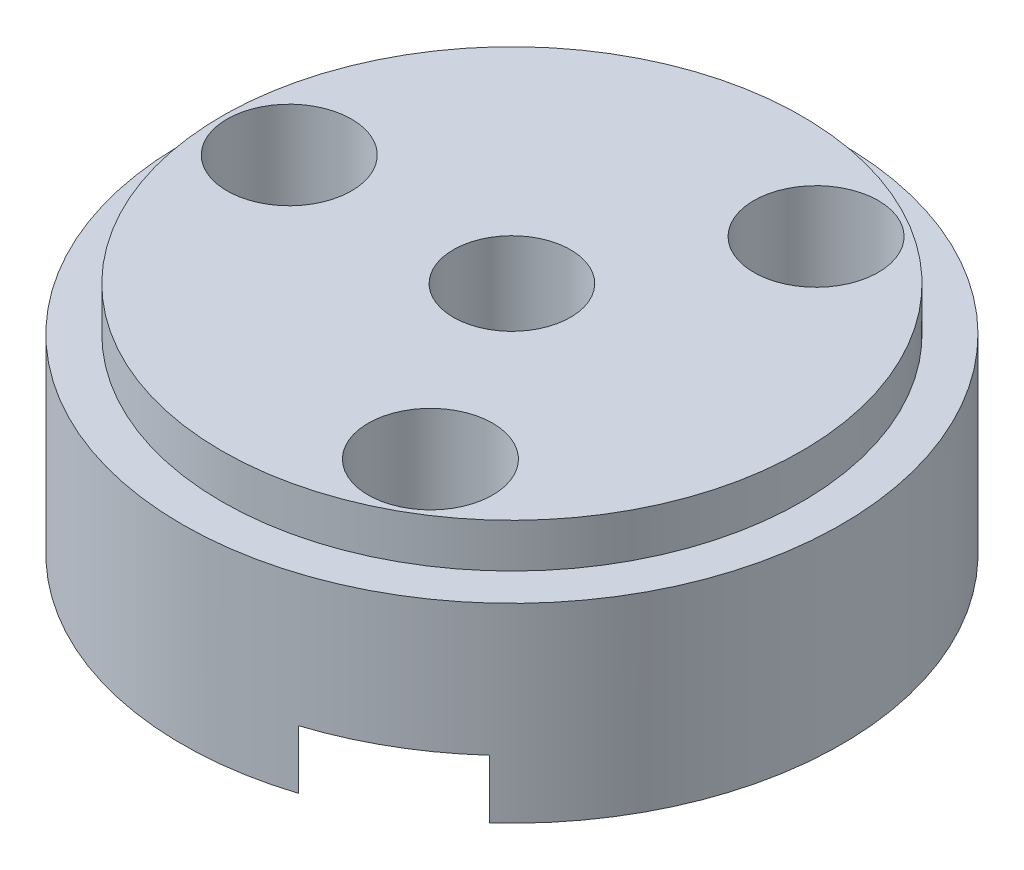
ISO-10303-21;
HEADER;
FILE_DESCRIPTION(('STEP AP214'),'2;1');
FILE_NAME('part.step','',(''),(''),'','','');
FILE_SCHEMA(('AUTOMOTIVE_DESIGN { 1 0 10303 214 1 1 1 1 }'));
ENDSEC;
DATA;
#1=APPLICATION_CONTEXT('core data for automotive mechanical design processes');
#2=APPLICATION_PROTOCOL_DEFINITION('international standard','automotive_design',2000,#1);
#3=PRODUCT_CONTEXT('',#1,'mechanical');
#4=PRODUCT('Part','Part','',(#3));
#5=PRODUCT_RELATED_PRODUCT_CATEGORY('part','',(#4));
#6=PRODUCT_DEFINITION_FORMATION('','',#4);
#7=PRODUCT_DEFINITION_CONTEXT('part definition',#1,'design');
#8=PRODUCT_DEFINITION('design','',#6,#7);
#9=PRODUCT_DEFINITION_SHAPE('','',#8);
#10=(LENGTH_UNIT() NAMED_UNIT(*) SI_UNIT(.MILLI.,.METRE.));
#11=(NAMED_UNIT(*) PLANE_ANGLE_UNIT() SI_UNIT($,.RADIAN.));
#12=(NAMED_UNIT(*) SI_UNIT($,.STERADIAN.) SOLID_ANGLE_UNIT());
#13=UNCERTAINTY_MEASURE_WITH_UNIT(LENGTH_MEASURE(1.E-05),#10,'distance_accuracy_value','');
#14=(GEOMETRIC_REPRESENTATION_CONTEXT(3) GLOBAL_UNCERTAINTY_ASSIGNED_CONTEXT((#13)) GLOBAL_UNIT_ASSIGNED_CONTEXT((#10,
#11,#12)) REPRESENTATION_CONTEXT('',''));
#15=CARTESIAN_POINT('',(0.,0.,0.));
#16=DIRECTION('',(0.,0.,1.));
#17=DIRECTION('',(1.,0.,0.));
#18=AXIS2_PLACEMENT_3D('',#15,#16,#17);
#19=CARTESIAN_POINT('',(0.,8.,0.));
#20=DIRECTION('',(0.,1.,0.));
#21=DIRECTION('',(0.,0.,1.));
#22=AXIS2_PLACEMENT_3D('',#19,#20,#21);
#23=PLANE('',#22);
#24=CARTESIAN_POINT('',(0.,8.,0.));
#25=DIRECTION('',(0.,1.,0.));
#26=DIRECTION('',(0.,0.,1.));
#27=AXIS2_PLACEMENT_3D('',#24,#25,#26);
#28=CIRCLE('',#27,2.);
#29=CARTESIAN_POINT('',(0.,8.,2.));
#30=VERTEX_POINT('',#29);
#31=EDGE_CURVE('E122',#30,#30,#28,.T.);
#32=ORIENTED_EDGE('',*,*,#31,.F.);
#33=EDGE_LOOP('',(#32));
#34=FACE_BOUND('',#33,.T.);
#35=CARTESIAN_POINT('',(3.79999999999994,8.,-6.58179306876177));
#36=DIRECTION('',(0.,-1.,0.));
#37=DIRECTION('',(0.,0.,-1.));
#38=AXIS2_PLACEMENT_3D('',#35,#36,#37);
#39=CIRCLE('',#38,2.125);
#40=CARTESIAN_POINT('',(3.79999999999994,8.,-8.70679306876177));
#41=VERTEX_POINT('',#40);
#42=EDGE_CURVE('E178',#41,#41,#39,.T.);
#43=ORIENTED_EDGE('',*,*,#42,.T.);
#44=EDGE_LOOP('',(#43));
#45=FACE_BOUND('',#44,.T.);
#46=CARTESIAN_POINT('',(3.80000000000003,8.,6.58179306876172));
#47=DIRECTION('',(0.,-1.,0.));
#48=DIRECTION('',(0.,0.,-1.));
#49=AXIS2_PLACEMENT_3D('',#46,#47,#48);
#50=CIRCLE('',#49,2.125);
#51=CARTESIAN_POINT('',(3.80000000000003,8.,4.45679306876172));
#52=VERTEX_POINT('',#51);
#53=EDGE_CURVE('E183',#52,#52,#50,.T.);
#54=ORIENTED_EDGE('',*,*,#53,.T.);
#55=EDGE_LOOP('',(#54));
#56=FACE_BOUND('',#55,.T.);
#57=CARTESIAN_POINT('',(-7.6,8.,0.));
#58=DIRECTION('',(0.,-1.,0.));
#59=DIRECTION('',(0.,0.,-1.));
#60=AXIS2_PLACEMENT_3D('',#57,#58,#59);
#61=CIRCLE('',#60,2.125);
#62=CARTESIAN_POINT('',(-7.6,8.,-2.125));
#63=VERTEX_POINT('',#62);
#64=EDGE_CURVE('E179',#63,#63,#61,.T.);
#65=ORIENTED_EDGE('',*,*,#64,.T.);
#66=EDGE_LOOP('',(#65));
#67=FACE_BOUND('',#66,.T.);
#68=CARTESIAN_POINT('',(0.,8.,0.));
#69=DIRECTION('',(0.,1.,0.));
#70=DIRECTION('',(0.,0.,1.));
#71=AXIS2_PLACEMENT_3D('',#68,#69,#70);
#72=CIRCLE('',#71,9.9);
#73=CARTESIAN_POINT('',(0.,8.,9.9));
#74=VERTEX_POINT('',#73);
#75=EDGE_CURVE('E224',#74,#74,#72,.T.);
#76=ORIENTED_EDGE('',*,*,#75,.T.);
#77=EDGE_LOOP('',(#76));
#78=FACE_BOUND('',#77,.T.);
#79=ADVANCED_FACE('F44',(#34,#45,#56,#67,#78),#23,.T.);
#80=CARTESIAN_POINT('',(0.,8.,0.));
#81=DIRECTION('',(0.,-1.,0.));
#82=DIRECTION('',(0.,0.,-1.));
#83=AXIS2_PLACEMENT_3D('',#80,#81,#82);
#84=CYLINDRICAL_SURFACE('',#83,11.25);
#85=CARTESIAN_POINT('',(0.,0.,0.));
#86=DIRECTION('',(0.,1.,0.));
#87=DIRECTION('',(0.,0.,1.));
#88=AXIS2_PLACEMENT_3D('',#85,#86,#87);
#89=CIRCLE('',#88,11.25);
#90=CARTESIAN_POINT('',(3.42779893572812,0.,-10.7150685698329));
#91=VERTEX_POINT('',#90);
#92=CARTESIAN_POINT('',(-10.9934210526316,0.,-2.38897332751054));
#93=VERTEX_POINT('',#92);
#94=EDGE_CURVE('E121',#91,#93,#89,.T.);
#95=ORIENTED_EDGE('',*,*,#94,.T.);
#96=DIRECTION('',(0.,-1.,0.));
#97=VECTOR('',#96,1.);
#98=CARTESIAN_POINT('',(-10.9934210526316,1.,-2.38897332751054));
#99=LINE('',#98,#97);
#100=CARTESIAN_POINT('',(-10.9934210526316,2.,-2.38897332751054));
#101=VERTEX_POINT('',#100);
#102=EDGE_CURVE('E11',#93,#101,#99,.F.);
#103=ORIENTED_EDGE('',*,*,#102,.T.);
#104=CARTESIAN_POINT('',(0.,2.,0.));
#105=DIRECTION('',(0.,-1.,0.));
#106=DIRECTION('',(0.,0.,-1.));
#107=AXIS2_PLACEMENT_3D('',#104,#105,#106);
#108=CIRCLE('',#107,11.25);
#109=CARTESIAN_POINT('',(-10.9934210526316,2.,2.38897332751054));
#110=VERTEX_POINT('',#109);
#111=EDGE_CURVE('E113',#110,#101,#108,.T.);
#112=ORIENTED_EDGE('',*,*,#111,.F.);
#113=DIRECTION('',(0.,-1.,0.));
#114=VECTOR('',#113,1.);
#115=CARTESIAN_POINT('',(-10.9934210526316,1.,2.38897332751054));
#116=LINE('',#115,#114);
#117=CARTESIAN_POINT('',(-10.9934210526316,0.,2.38897332751054));
#118=VERTEX_POINT('',#117);
#119=EDGE_CURVE('E53',#110,#118,#116,.T.);
#120=ORIENTED_EDGE('',*,*,#119,.T.);
#121=CARTESIAN_POINT('',(3.42779893572827,0.,10.7150685698329));
#122=VERTEX_POINT('',#121);
#123=EDGE_CURVE('E112',#118,#122,#89,.T.);
#124=ORIENTED_EDGE('',*,*,#123,.T.);
#125=DIRECTION('',(0.,-1.,0.));
#126=VECTOR('',#125,1.);
#127=CARTESIAN_POINT('',(3.42779893572827,1.,10.7150685698329));
#128=LINE('',#127,#126);
#129=CARTESIAN_POINT('',(3.42779893572827,2.,10.7150685698329));
#130=VERTEX_POINT('',#129);
#131=EDGE_CURVE('E115',#122,#130,#128,.F.);
#132=ORIENTED_EDGE('',*,*,#131,.T.);
#133=CARTESIAN_POINT('',(0.,2.,0.));
#134=DIRECTION('',(0.,-1.,0.));
#135=DIRECTION('',(0.,0.,-1.));
#136=AXIS2_PLACEMENT_3D('',#133,#134,#135);
#137=CIRCLE('',#136,11.25);
#138=CARTESIAN_POINT('',(7.5656221169034,2.,8.32609524232231));
#139=VERTEX_POINT('',#138);
#140=EDGE_CURVE('E154',#139,#130,#137,.T.);
#141=ORIENTED_EDGE('',*,*,#140,.F.);
#142=DIRECTION('',(0.,-1.,0.));
#143=VECTOR('',#142,1.);
#144=CARTESIAN_POINT('',(7.5656221169034,1.,8.32609524232231));
#145=LINE('',#144,#143);
#146=CARTESIAN_POINT('',(7.5656221169034,0.,8.32609524232231));
#147=VERTEX_POINT('',#146);
#148=EDGE_CURVE('E144',#139,#147,#145,.T.);
#149=ORIENTED_EDGE('',*,*,#148,.T.);
#150=CARTESIAN_POINT('',(7.56562211690328,0.,-8.32609524232241));
#151=VERTEX_POINT('',#150);
#152=EDGE_CURVE('E124',#147,#151,#89,.T.);
#153=ORIENTED_EDGE('',*,*,#152,.T.);
#154=DIRECTION('',(0.,-1.,0.));
#155=VECTOR('',#154,1.);
#156=CARTESIAN_POINT('',(7.56562211690328,1.,-8.32609524232241));
#157=LINE('',#156,#155);
#158=CARTESIAN_POINT('',(7.56562211690328,2.,-8.32609524232241));
#159=VERTEX_POINT('',#158);
#160=EDGE_CURVE('E139',#151,#159,#157,.F.);
#161=ORIENTED_EDGE('',*,*,#160,.T.);
#162=CARTESIAN_POINT('',(0.,2.,0.));
#163=DIRECTION('',(0.,-1.,0.));
#164=DIRECTION('',(0.,0.,-1.));
#165=AXIS2_PLACEMENT_3D('',#162,#163,#164);
#166=CIRCLE('',#165,11.25);
#167=CARTESIAN_POINT('',(3.42779893572812,2.,-10.7150685698329));
#168=VERTEX_POINT('',#167);
#169=EDGE_CURVE('E175',#168,#159,#166,.T.);
#170=ORIENTED_EDGE('',*,*,#169,.F.);
#171=DIRECTION('',(0.,-1.,0.));
#172=VECTOR('',#171,1.);
#173=CARTESIAN_POINT('',(3.42779893572812,1.,-10.7150685698329));
#174=LINE('',#173,#172);
#175=EDGE_CURVE('E134',#168,#91,#174,.T.);
#176=ORIENTED_EDGE('',*,*,#175,.T.);
#177=EDGE_LOOP('',(#95,#103,#112,#120,#124,#132,#141,#149,#153,#161,#170,#176));
#178=FACE_BOUND('',#177,.T.);
#179=CARTESIAN_POINT('',(0.,6.5,0.));
#180=DIRECTION('',(0.,1.,0.));
#181=DIRECTION('',(0.,0.,1.));
#182=AXIS2_PLACEMENT_3D('',#179,#180,#181);
#183=CIRCLE('',#182,11.25);
#184=CARTESIAN_POINT('',(0.,6.5,11.25));
#185=VERTEX_POINT('',#184);
#186=EDGE_CURVE('E168',#185,#185,#183,.T.);
#187=ORIENTED_EDGE('',*,*,#186,.F.);
#188=EDGE_LOOP('',(#187));
#189=FACE_BOUND('',#188,.T.);
#190=ADVANCED_FACE('F46',(#178,#189),#84,.T.);
#191=CARTESIAN_POINT('',(3.79999999999994,8.,-6.58179306876177));
#192=DIRECTION('',(0.,-1.,0.));
#193=DIRECTION('',(0.,0.,-1.));
#194=AXIS2_PLACEMENT_3D('',#191,#192,#193);
#195=CYLINDRICAL_SURFACE('',#194,2.125);
#196=ORIENTED_EDGE('',*,*,#42,.F.);
#197=EDGE_LOOP('',(#196));
#198=FACE_BOUND('',#197,.T.);
#199=CARTESIAN_POINT('',(3.79999999999994,2.,-6.58179306876177));
#200=DIRECTION('',(0.,-1.,0.));
#201=DIRECTION('',(0.,0.,-1.));
#202=AXIS2_PLACEMENT_3D('',#199,#200,#201);
#203=CIRCLE('',#202,2.125);
#204=CARTESIAN_POINT('',(3.79999999999994,2.,-8.70679306876177));
#205=VERTEX_POINT('',#204);
#206=EDGE_CURVE('E147',#205,#205,#203,.F.);
#207=ORIENTED_EDGE('',*,*,#206,.F.);
#208=EDGE_LOOP('',(#207));
#209=FACE_BOUND('',#208,.T.);
#210=ADVANCED_FACE('F213',(#198,#209),#195,.F.);
#211=CARTESIAN_POINT('',(3.80000000000003,8.,6.58179306876172));
#212=DIRECTION('',(0.,-1.,0.));
#213=DIRECTION('',(0.,0.,-1.));
#214=AXIS2_PLACEMENT_3D('',#211,#212,#213);
#215=CYLINDRICAL_SURFACE('',#214,2.125);
#216=ORIENTED_EDGE('',*,*,#53,.F.);
#217=EDGE_LOOP('',(#216));
#218=FACE_BOUND('',#217,.T.);
#219=CARTESIAN_POINT('',(3.80000000000003,2.,6.58179306876172));
#220=DIRECTION('',(0.,-1.,0.));
#221=DIRECTION('',(0.,0.,-1.));
#222=AXIS2_PLACEMENT_3D('',#219,#220,#221);
#223=CIRCLE('',#222,2.125);
#224=CARTESIAN_POINT('',(3.80000000000003,2.,4.45679306876172));
#225=VERTEX_POINT('',#224);
#226=EDGE_CURVE('E171',#225,#225,#223,.F.);
#227=ORIENTED_EDGE('',*,*,#226,.F.);
#228=EDGE_LOOP('',(#227));
#229=FACE_BOUND('',#228,.T.);
#230=ADVANCED_FACE('F247',(#218,#229),#215,.F.);
#231=CARTESIAN_POINT('',(-7.6,8.,0.));
#232=DIRECTION('',(0.,-1.,0.));
#233=DIRECTION('',(0.,0.,-1.));
#234=AXIS2_PLACEMENT_3D('',#231,#232,#233);
#235=CYLINDRICAL_SURFACE('',#234,2.125);
#236=ORIENTED_EDGE('',*,*,#64,.F.);
#237=EDGE_LOOP('',(#236));
#238=FACE_BOUND('',#237,.T.);
#239=CARTESIAN_POINT('',(-7.6,2.,0.));
#240=DIRECTION('',(0.,-1.,0.));
#241=DIRECTION('',(0.,0.,-1.));
#242=AXIS2_PLACEMENT_3D('',#239,#240,#241);
#243=CIRCLE('',#242,2.125);
#244=CARTESIAN_POINT('',(-7.6,2.,-2.125));
#245=VERTEX_POINT('',#244);
#246=EDGE_CURVE('E172',#245,#245,#243,.F.);
#247=ORIENTED_EDGE('',*,*,#246,.F.);
#248=EDGE_LOOP('',(#247));
#249=FACE_BOUND('',#248,.T.);
#250=ADVANCED_FACE('F204',(#238,#249),#235,.F.);
#251=CARTESIAN_POINT('',(0.,0.,0.));
#252=DIRECTION('',(0.,1.,0.));
#253=DIRECTION('',(0.,0.,1.));
#254=AXIS2_PLACEMENT_3D('',#251,#252,#253);
#255=PLANE('',#254);
#256=ORIENTED_EDGE('',*,*,#123,.F.);
#257=CARTESIAN_POINT('',(-7.6,0.,0.));
#258=DIRECTION('',(0.,-1.,0.));
#259=DIRECTION('',(0.,0.,-1.));
#260=AXIS2_PLACEMENT_3D('',#257,#258,#259);
#261=CIRCLE('',#260,4.15);
#262=EDGE_CURVE('E97',#93,#118,#261,.T.);
#263=ORIENTED_EDGE('',*,*,#262,.F.);
#264=ORIENTED_EDGE('',*,*,#94,.F.);
#265=CARTESIAN_POINT('',(3.79999999999994,0.,-6.58179306876177));
#266=DIRECTION('',(0.,-1.,0.));
#267=DIRECTION('',(0.,0.,-1.));
#268=AXIS2_PLACEMENT_3D('',#265,#266,#267);
#269=CIRCLE('',#268,4.15);
#270=EDGE_CURVE('E158',#151,#91,#269,.T.);
#271=ORIENTED_EDGE('',*,*,#270,.F.);
#272=ORIENTED_EDGE('',*,*,#152,.F.);
#273=CARTESIAN_POINT('',(3.80000000000003,0.,6.58179306876172));
#274=DIRECTION('',(0.,-1.,0.));
#275=DIRECTION('',(0.,0.,-1.));
#276=AXIS2_PLACEMENT_3D('',#273,#274,#275);
#277=CIRCLE('',#276,4.15);
#278=EDGE_CURVE('E106',#122,#147,#277,.T.);
#279=ORIENTED_EDGE('',*,*,#278,.F.);
#280=EDGE_LOOP('',(#256,#263,#264,#271,#272,#279));
#281=FACE_BOUND('',#280,.T.);
#282=CARTESIAN_POINT('',(0.,0.,0.));
#283=DIRECTION('',(0.,1.,0.));
#284=DIRECTION('',(0.,0.,1.));
#285=AXIS2_PLACEMENT_3D('',#282,#283,#284);
#286=CIRCLE('',#285,2.);
#287=CARTESIAN_POINT('',(0.,0.,2.));
#288=VERTEX_POINT('',#287);
#289=EDGE_CURVE('E128',#288,#288,#286,.T.);
#290=ORIENTED_EDGE('',*,*,#289,.T.);
#291=EDGE_LOOP('',(#290));
#292=FACE_BOUND('',#291,.T.);
#293=ADVANCED_FACE('F117',(#281,#292),#255,.F.);
#294=CARTESIAN_POINT('',(0.,8.,0.));
#295=DIRECTION('',(0.,-1.,0.));
#296=DIRECTION('',(0.,0.,-1.));
#297=AXIS2_PLACEMENT_3D('',#294,#295,#296);
#298=CYLINDRICAL_SURFACE('',#297,2.);
#299=ORIENTED_EDGE('',*,*,#31,.T.);
#300=EDGE_LOOP('',(#299));
#301=FACE_BOUND('',#300,.T.);
#302=ORIENTED_EDGE('',*,*,#289,.F.);
#303=EDGE_LOOP('',(#302));
#304=FACE_BOUND('',#303,.T.);
#305=ADVANCED_FACE('F193',(#301,#304),#298,.F.);
#306=CARTESIAN_POINT('',(-7.6,2.,0.));
#307=DIRECTION('',(0.,-1.,0.));
#308=DIRECTION('',(0.,0.,-1.));
#309=AXIS2_PLACEMENT_3D('',#306,#307,#308);
#310=CYLINDRICAL_SURFACE('',#309,4.15);
#311=ORIENTED_EDGE('',*,*,#262,.T.);
#312=ORIENTED_EDGE('',*,*,#119,.F.);
#313=CARTESIAN_POINT('',(-7.6,2.,0.));
#314=DIRECTION('',(0.,-1.,0.));
#315=DIRECTION('',(0.,0.,-1.));
#316=AXIS2_PLACEMENT_3D('',#313,#314,#315);
#317=CIRCLE('',#316,4.15);
#318=EDGE_CURVE('E59',#101,#110,#317,.T.);
#319=ORIENTED_EDGE('',*,*,#318,.F.);
#320=ORIENTED_EDGE('',*,*,#102,.F.);
#321=EDGE_LOOP('',(#311,#312,#319,#320));
#322=FACE_BOUND('',#321,.T.);
#323=ADVANCED_FACE('F99',(#322),#310,.F.);
#324=CARTESIAN_POINT('',(-7.6,2.,0.));
#325=DIRECTION('',(0.,-1.,0.));
#326=DIRECTION('',(0.,0.,-1.));
#327=AXIS2_PLACEMENT_3D('',#324,#325,#326);
#328=PLANE('',#327);
#329=ORIENTED_EDGE('',*,*,#246,.T.);
#330=EDGE_LOOP('',(#329));
#331=FACE_BOUND('',#330,.T.);
#332=ORIENTED_EDGE('',*,*,#111,.T.);
#333=ORIENTED_EDGE('',*,*,#318,.T.);
#334=EDGE_LOOP('',(#332,#333));
#335=FACE_BOUND('',#334,.T.);
#336=ADVANCED_FACE('F201',(#331,#335),#328,.T.);
#337=CARTESIAN_POINT('',(3.80000000000003,2.,6.58179306876172));
#338=DIRECTION('',(0.,-1.,0.));
#339=DIRECTION('',(0.,0.,-1.));
#340=AXIS2_PLACEMENT_3D('',#337,#338,#339);
#341=CYLINDRICAL_SURFACE('',#340,4.15);
#342=ORIENTED_EDGE('',*,*,#278,.T.);
#343=ORIENTED_EDGE('',*,*,#148,.F.);
#344=CARTESIAN_POINT('',(3.80000000000003,2.,6.58179306876172));
#345=DIRECTION('',(0.,-1.,0.));
#346=DIRECTION('',(0.,0.,-1.));
#347=AXIS2_PLACEMENT_3D('',#344,#345,#346);
#348=CIRCLE('',#347,4.15);
#349=EDGE_CURVE('E66',#130,#139,#348,.T.);
#350=ORIENTED_EDGE('',*,*,#349,.F.);
#351=ORIENTED_EDGE('',*,*,#131,.F.);
#352=EDGE_LOOP('',(#342,#343,#350,#351));
#353=FACE_BOUND('',#352,.T.);
#354=ADVANCED_FACE('F156',(#353),#341,.F.);
#355=CARTESIAN_POINT('',(3.80000000000003,2.,6.58179306876172));
#356=DIRECTION('',(0.,-1.,0.));
#357=DIRECTION('',(0.,0.,-1.));
#358=AXIS2_PLACEMENT_3D('',#355,#356,#357);
#359=PLANE('',#358);
#360=ORIENTED_EDGE('',*,*,#226,.T.);
#361=EDGE_LOOP('',(#360));
#362=FACE_BOUND('',#361,.T.);
#363=ORIENTED_EDGE('',*,*,#140,.T.);
#364=ORIENTED_EDGE('',*,*,#349,.T.);
#365=EDGE_LOOP('',(#363,#364));
#366=FACE_BOUND('',#365,.T.);
#367=ADVANCED_FACE('F245',(#362,#366),#359,.T.);
#368=CARTESIAN_POINT('',(3.79999999999994,2.,-6.58179306876177));
#369=DIRECTION('',(0.,-1.,0.));
#370=DIRECTION('',(0.,0.,-1.));
#371=AXIS2_PLACEMENT_3D('',#368,#369,#370);
#372=CYLINDRICAL_SURFACE('',#371,4.15);
#373=ORIENTED_EDGE('',*,*,#270,.T.);
#374=ORIENTED_EDGE('',*,*,#175,.F.);
#375=CARTESIAN_POINT('',(3.79999999999994,2.,-6.58179306876177));
#376=DIRECTION('',(0.,-1.,0.));
#377=DIRECTION('',(0.,0.,-1.));
#378=AXIS2_PLACEMENT_3D('',#375,#376,#377);
#379=CIRCLE('',#378,4.15);
#380=EDGE_CURVE('E163',#159,#168,#379,.T.);
#381=ORIENTED_EDGE('',*,*,#380,.F.);
#382=ORIENTED_EDGE('',*,*,#160,.F.);
#383=EDGE_LOOP('',(#373,#374,#381,#382));
#384=FACE_BOUND('',#383,.T.);
#385=ADVANCED_FACE('F261',(#384),#372,.F.);
#386=CARTESIAN_POINT('',(3.79999999999994,2.,-6.58179306876177));
#387=DIRECTION('',(0.,-1.,0.));
#388=DIRECTION('',(0.,0.,-1.));
#389=AXIS2_PLACEMENT_3D('',#386,#387,#388);
#390=PLANE('',#389);
#391=ORIENTED_EDGE('',*,*,#206,.T.);
#392=EDGE_LOOP('',(#391));
#393=FACE_BOUND('',#392,.T.);
#394=ORIENTED_EDGE('',*,*,#169,.T.);
#395=ORIENTED_EDGE('',*,*,#380,.T.);
#396=EDGE_LOOP('',(#394,#395));
#397=FACE_BOUND('',#396,.T.);
#398=ADVANCED_FACE('F258',(#393,#397),#390,.T.);
#399=CARTESIAN_POINT('',(0.,6.5,0.));
#400=DIRECTION('',(0.,1.,0.));
#401=DIRECTION('',(0.,0.,1.));
#402=AXIS2_PLACEMENT_3D('',#399,#400,#401);
#403=PLANE('',#402);
#404=CARTESIAN_POINT('',(0.,6.5,0.));
#405=DIRECTION('',(0.,1.,0.));
#406=DIRECTION('',(0.,0.,1.));
#407=AXIS2_PLACEMENT_3D('',#404,#405,#406);
#408=CIRCLE('',#407,9.9);
#409=CARTESIAN_POINT('',(0.,6.5,9.9));
#410=VERTEX_POINT('',#409);
#411=EDGE_CURVE('E227',#410,#410,#408,.T.);
#412=ORIENTED_EDGE('',*,*,#411,.F.);
#413=EDGE_LOOP('',(#412));
#414=FACE_BOUND('',#413,.T.);
#415=ORIENTED_EDGE('',*,*,#186,.T.);
#416=EDGE_LOOP('',(#415));
#417=FACE_BOUND('',#416,.T.);
#418=ADVANCED_FACE('F260',(#414,#417),#403,.T.);
#419=CARTESIAN_POINT('',(0.,6.5,0.));
#420=DIRECTION('',(0.,1.,0.));
#421=DIRECTION('',(0.,0.,1.));
#422=AXIS2_PLACEMENT_3D('',#419,#420,#421);
#423=CYLINDRICAL_SURFACE('',#422,9.9);
#424=ORIENTED_EDGE('',*,*,#411,.T.);
#425=EDGE_LOOP('',(#424));
#426=FACE_BOUND('',#425,.T.);
#427=ORIENTED_EDGE('',*,*,#75,.F.);
#428=EDGE_LOOP('',(#427));
#429=FACE_BOUND('',#428,.T.);
#430=ADVANCED_FACE('F274',(#426,#429),#423,.T.);
#431=CLOSED_SHELL('',(#79,#190,#210,#230,#250,#293,#305,#323,#336,#354,#367,#385,#398,#418,#430));
#432=MANIFOLD_SOLID_BREP('B2',#431);
#433=ADVANCED_BREP_SHAPE_REPRESENTATION('',(#18,#432),#14);
#434=SHAPE_DEFINITION_REPRESENTATION(#9,#433);
ENDSEC;
END-ISO-10303-21;
